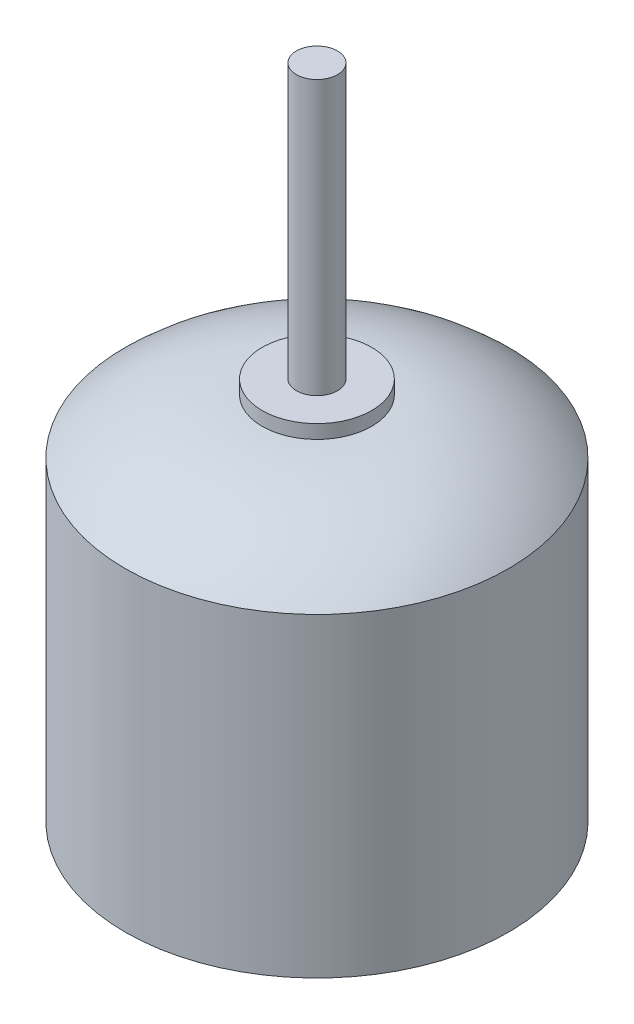
ISO-10303-21;
HEADER;
FILE_DESCRIPTION(('STEP AP214'),'2;1');
FILE_NAME('part.step','',(''),(''),'','','');
FILE_SCHEMA(('AUTOMOTIVE_DESIGN { 1 0 10303 214 1 1 1 1 }'));
ENDSEC;
DATA;
#1=APPLICATION_CONTEXT('core data for automotive mechanical design processes');
#2=APPLICATION_PROTOCOL_DEFINITION('international standard','automotive_design',2000,#1);
#3=PRODUCT_CONTEXT('',#1,'mechanical');
#4=PRODUCT('Part','Part','',(#3));
#5=PRODUCT_RELATED_PRODUCT_CATEGORY('part','',(#4));
#6=PRODUCT_DEFINITION_FORMATION('','',#4);
#7=PRODUCT_DEFINITION_CONTEXT('part definition',#1,'design');
#8=PRODUCT_DEFINITION('design','',#6,#7);
#9=PRODUCT_DEFINITION_SHAPE('','',#8);
#10=(LENGTH_UNIT() NAMED_UNIT(*) SI_UNIT(.MILLI.,.METRE.));
#11=(NAMED_UNIT(*) PLANE_ANGLE_UNIT() SI_UNIT($,.RADIAN.));
#12=(NAMED_UNIT(*) SI_UNIT($,.STERADIAN.) SOLID_ANGLE_UNIT());
#13=UNCERTAINTY_MEASURE_WITH_UNIT(LENGTH_MEASURE(1.E-05),#10,'distance_accuracy_value','');
#14=(GEOMETRIC_REPRESENTATION_CONTEXT(3) GLOBAL_UNCERTAINTY_ASSIGNED_CONTEXT((#13)) GLOBAL_UNIT_ASSIGNED_CONTEXT((#10,
#11,#12)) REPRESENTATION_CONTEXT('',''));
#15=CARTESIAN_POINT('',(0.,0.,0.));
#16=DIRECTION('',(0.,0.,1.));
#17=DIRECTION('',(1.,0.,0.));
#18=AXIS2_PLACEMENT_3D('',#15,#16,#17);
#19=CARTESIAN_POINT('',(0.,28.,0.));
#20=DIRECTION('',(0.,-1.,0.));
#21=DIRECTION('',(0.,0.,-1.));
#22=AXIS2_PLACEMENT_3D('',#19,#20,#21);
#23=CYLINDRICAL_SURFACE('',#22,14.);
#24=CARTESIAN_POINT('',(0.,23.,0.));
#25=DIRECTION('',(0.,1.,0.));
#26=DIRECTION('',(0.,0.,1.));
#27=AXIS2_PLACEMENT_3D('',#24,#25,#26);
#28=CIRCLE('',#27,14.);
#29=CARTESIAN_POINT('',(0.,23.,14.));
#30=VERTEX_POINT('',#29);
#31=EDGE_CURVE('E52',#30,#30,#28,.T.);
#32=ORIENTED_EDGE('',*,*,#31,.F.);
#33=EDGE_LOOP('',(#32));
#34=FACE_BOUND('',#33,.T.);
#35=CARTESIAN_POINT('',(0.,0.,0.));
#36=DIRECTION('',(0.,1.,0.));
#37=DIRECTION('',(0.,0.,1.));
#38=AXIS2_PLACEMENT_3D('',#35,#36,#37);
#39=CIRCLE('',#38,14.);
#40=CARTESIAN_POINT('',(0.,0.,14.));
#41=VERTEX_POINT('',#40);
#42=EDGE_CURVE('E40',#41,#41,#39,.T.);
#43=ORIENTED_EDGE('',*,*,#42,.T.);
#44=EDGE_LOOP('',(#43));
#45=FACE_BOUND('',#44,.T.);
#46=ADVANCED_FACE('F37',(#34,#45),#23,.T.);
#47=CARTESIAN_POINT('',(0.,0.,0.));
#48=DIRECTION('',(0.,1.,0.));
#49=DIRECTION('',(0.,0.,1.));
#50=AXIS2_PLACEMENT_3D('',#47,#48,#49);
#51=PLANE('',#50);
#52=CARTESIAN_POINT('',(0.,0.,8.));
#53=DIRECTION('',(0.,-1.,0.));
#54=DIRECTION('',(0.,0.,-1.));
#55=AXIS2_PLACEMENT_3D('',#52,#53,#54);
#56=CIRCLE('',#55,1.5);
#57=CARTESIAN_POINT('',(0.,0.,6.5));
#58=VERTEX_POINT('',#57);
#59=EDGE_CURVE('E64',#58,#58,#56,.T.);
#60=ORIENTED_EDGE('',*,*,#59,.F.);
#61=EDGE_LOOP('',(#60));
#62=FACE_BOUND('',#61,.T.);
#63=CARTESIAN_POINT('',(9.5,0.,0.));
#64=DIRECTION('',(0.,-1.,0.));
#65=DIRECTION('',(0.,0.,-1.));
#66=AXIS2_PLACEMENT_3D('',#63,#64,#65);
#67=CIRCLE('',#66,1.5);
#68=CARTESIAN_POINT('',(9.5,0.,-1.5));
#69=VERTEX_POINT('',#68);
#70=EDGE_CURVE('E67',#69,#69,#67,.T.);
#71=ORIENTED_EDGE('',*,*,#70,.F.);
#72=EDGE_LOOP('',(#71));
#73=FACE_BOUND('',#72,.T.);
#74=CARTESIAN_POINT('',(0.,0.,-8.));
#75=DIRECTION('',(0.,-1.,0.));
#76=DIRECTION('',(0.,0.,-1.));
#77=AXIS2_PLACEMENT_3D('',#74,#75,#76);
#78=CIRCLE('',#77,1.5);
#79=CARTESIAN_POINT('',(0.,0.,-9.5));
#80=VERTEX_POINT('',#79);
#81=EDGE_CURVE('E73',#80,#80,#78,.T.);
#82=ORIENTED_EDGE('',*,*,#81,.F.);
#83=EDGE_LOOP('',(#82));
#84=FACE_BOUND('',#83,.T.);
#85=CARTESIAN_POINT('',(-9.5,0.,0.));
#86=DIRECTION('',(0.,-1.,0.));
#87=DIRECTION('',(0.,0.,-1.));
#88=AXIS2_PLACEMENT_3D('',#85,#86,#87);
#89=CIRCLE('',#88,1.5);
#90=CARTESIAN_POINT('',(-9.5,0.,-1.5));
#91=VERTEX_POINT('',#90);
#92=EDGE_CURVE('E79',#91,#91,#89,.T.);
#93=ORIENTED_EDGE('',*,*,#92,.F.);
#94=EDGE_LOOP('',(#93));
#95=FACE_BOUND('',#94,.T.);
#96=ORIENTED_EDGE('',*,*,#42,.F.);
#97=EDGE_LOOP('',(#96));
#98=FACE_BOUND('',#97,.T.);
#99=ADVANCED_FACE('F89',(#62,#73,#84,#95,#98),#51,.F.);
#100=CARTESIAN_POINT('',(-9.5,4.,0.));
#101=DIRECTION('',(0.,-1.,0.));
#102=DIRECTION('',(0.,0.,-1.));
#103=AXIS2_PLACEMENT_3D('',#100,#101,#102);
#104=CYLINDRICAL_SURFACE('',#103,1.5);
#105=CARTESIAN_POINT('',(-9.5,4.,0.));
#106=DIRECTION('',(0.,-1.,0.));
#107=DIRECTION('',(0.,0.,-1.));
#108=AXIS2_PLACEMENT_3D('',#105,#106,#107);
#109=CIRCLE('',#108,1.5);
#110=CARTESIAN_POINT('',(-9.5,4.,-1.5));
#111=VERTEX_POINT('',#110);
#112=EDGE_CURVE('E61',#111,#111,#109,.T.);
#113=ORIENTED_EDGE('',*,*,#112,.F.);
#114=EDGE_LOOP('',(#113));
#115=FACE_BOUND('',#114,.T.);
#116=ORIENTED_EDGE('',*,*,#92,.T.);
#117=EDGE_LOOP('',(#116));
#118=FACE_BOUND('',#117,.T.);
#119=ADVANCED_FACE('F86',(#115,#118),#104,.F.);
#120=CARTESIAN_POINT('',(-9.5,4.,0.));
#121=DIRECTION('',(0.,-1.,0.));
#122=DIRECTION('',(0.,0.,-1.));
#123=AXIS2_PLACEMENT_3D('',#120,#121,#122);
#124=PLANE('',#123);
#125=ORIENTED_EDGE('',*,*,#112,.T.);
#126=EDGE_LOOP('',(#125));
#127=FACE_BOUND('',#126,.T.);
#128=ADVANCED_FACE('F84',(#127),#124,.T.);
#129=CARTESIAN_POINT('',(0.,4.,-8.));
#130=DIRECTION('',(0.,-1.,0.));
#131=DIRECTION('',(0.,0.,-1.));
#132=AXIS2_PLACEMENT_3D('',#129,#130,#131);
#133=CYLINDRICAL_SURFACE('',#132,1.5);
#134=CARTESIAN_POINT('',(0.,4.,-8.));
#135=DIRECTION('',(0.,-1.,0.));
#136=DIRECTION('',(0.,0.,-1.));
#137=AXIS2_PLACEMENT_3D('',#134,#135,#136);
#138=CIRCLE('',#137,1.5);
#139=CARTESIAN_POINT('',(0.,4.,-9.5));
#140=VERTEX_POINT('',#139);
#141=EDGE_CURVE('E76',#140,#140,#138,.T.);
#142=ORIENTED_EDGE('',*,*,#141,.F.);
#143=EDGE_LOOP('',(#142));
#144=FACE_BOUND('',#143,.T.);
#145=ORIENTED_EDGE('',*,*,#81,.T.);
#146=EDGE_LOOP('',(#145));
#147=FACE_BOUND('',#146,.T.);
#148=ADVANCED_FACE('F135',(#144,#147),#133,.F.);
#149=CARTESIAN_POINT('',(0.,4.,-8.));
#150=DIRECTION('',(0.,-1.,0.));
#151=DIRECTION('',(0.,0.,-1.));
#152=AXIS2_PLACEMENT_3D('',#149,#150,#151);
#153=PLANE('',#152);
#154=ORIENTED_EDGE('',*,*,#141,.T.);
#155=EDGE_LOOP('',(#154));
#156=FACE_BOUND('',#155,.T.);
#157=ADVANCED_FACE('F130',(#156),#153,.T.);
#158=CARTESIAN_POINT('',(9.5,4.,0.));
#159=DIRECTION('',(0.,-1.,0.));
#160=DIRECTION('',(0.,0.,-1.));
#161=AXIS2_PLACEMENT_3D('',#158,#159,#160);
#162=CYLINDRICAL_SURFACE('',#161,1.5);
#163=CARTESIAN_POINT('',(9.5,4.,0.));
#164=DIRECTION('',(0.,-1.,0.));
#165=DIRECTION('',(0.,0.,-1.));
#166=AXIS2_PLACEMENT_3D('',#163,#164,#165);
#167=CIRCLE('',#166,1.5);
#168=CARTESIAN_POINT('',(9.5,4.,-1.5));
#169=VERTEX_POINT('',#168);
#170=EDGE_CURVE('E70',#169,#169,#167,.T.);
#171=ORIENTED_EDGE('',*,*,#170,.F.);
#172=EDGE_LOOP('',(#171));
#173=FACE_BOUND('',#172,.T.);
#174=ORIENTED_EDGE('',*,*,#70,.T.);
#175=EDGE_LOOP('',(#174));
#176=FACE_BOUND('',#175,.T.);
#177=ADVANCED_FACE('F127',(#173,#176),#162,.F.);
#178=CARTESIAN_POINT('',(9.5,4.,0.));
#179=DIRECTION('',(0.,-1.,0.));
#180=DIRECTION('',(0.,0.,-1.));
#181=AXIS2_PLACEMENT_3D('',#178,#179,#180);
#182=PLANE('',#181);
#183=ORIENTED_EDGE('',*,*,#170,.T.);
#184=EDGE_LOOP('',(#183));
#185=FACE_BOUND('',#184,.T.);
#186=ADVANCED_FACE('F125',(#185),#182,.T.);
#187=CARTESIAN_POINT('',(0.,4.,8.));
#188=DIRECTION('',(0.,-1.,0.));
#189=DIRECTION('',(0.,0.,-1.));
#190=AXIS2_PLACEMENT_3D('',#187,#188,#189);
#191=CYLINDRICAL_SURFACE('',#190,1.5);
#192=CARTESIAN_POINT('',(0.,4.,8.));
#193=DIRECTION('',(0.,-1.,0.));
#194=DIRECTION('',(0.,0.,-1.));
#195=AXIS2_PLACEMENT_3D('',#192,#193,#194);
#196=CIRCLE('',#195,1.5);
#197=CARTESIAN_POINT('',(0.,4.,6.5));
#198=VERTEX_POINT('',#197);
#199=EDGE_CURVE('E48',#198,#198,#196,.T.);
#200=ORIENTED_EDGE('',*,*,#199,.F.);
#201=EDGE_LOOP('',(#200));
#202=FACE_BOUND('',#201,.T.);
#203=ORIENTED_EDGE('',*,*,#59,.T.);
#204=EDGE_LOOP('',(#203));
#205=FACE_BOUND('',#204,.T.);
#206=ADVANCED_FACE('F117',(#202,#205),#191,.F.);
#207=CARTESIAN_POINT('',(0.,4.,8.));
#208=DIRECTION('',(0.,-1.,0.));
#209=DIRECTION('',(0.,0.,-1.));
#210=AXIS2_PLACEMENT_3D('',#207,#208,#209);
#211=PLANE('',#210);
#212=ORIENTED_EDGE('',*,*,#199,.T.);
#213=EDGE_LOOP('',(#212));
#214=FACE_BOUND('',#213,.T.);
#215=ADVANCED_FACE('F108',(#214),#211,.T.);
#216=CARTESIAN_POINT('',(0.,12.5,0.));
#217=DIRECTION('',(0.,1.,0.));
#218=DIRECTION('',(0.,0.,1.));
#219=AXIS2_PLACEMENT_3D('',#216,#217,#218);
#220=DEGENERATE_TOROIDAL_SURFACE('',#219,4.,14.5,.T.);
#221=CARTESIAN_POINT('',(0.,27.,0.));
#222=DIRECTION('',(0.,1.,0.));
#223=DIRECTION('',(0.,0.,1.));
#224=AXIS2_PLACEMENT_3D('',#221,#222,#223);
#225=CIRCLE('',#224,4.);
#226=CARTESIAN_POINT('',(0.,27.,4.));
#227=VERTEX_POINT('',#226);
#228=EDGE_CURVE('E58',#227,#227,#225,.T.);
#229=ORIENTED_EDGE('',*,*,#228,.F.);
#230=EDGE_LOOP('',(#229));
#231=FACE_BOUND('',#230,.T.);
#232=ORIENTED_EDGE('',*,*,#31,.T.);
#233=EDGE_LOOP('',(#232));
#234=FACE_BOUND('',#233,.T.);
#235=ADVANCED_FACE('F106',(#231,#234),#220,.T.);
#236=CARTESIAN_POINT('',(0.,28.,0.));
#237=DIRECTION('',(0.,1.,0.));
#238=DIRECTION('',(0.,0.,1.));
#239=AXIS2_PLACEMENT_3D('',#236,#237,#238);
#240=CYLINDRICAL_SURFACE('',#239,4.);
#241=CARTESIAN_POINT('',(0.,28.,0.));
#242=DIRECTION('',(0.,1.,0.));
#243=DIRECTION('',(0.,0.,1.));
#244=AXIS2_PLACEMENT_3D('',#241,#242,#243);
#245=CIRCLE('',#244,4.);
#246=CARTESIAN_POINT('',(0.,28.,4.));
#247=VERTEX_POINT('',#246);
#248=EDGE_CURVE('E55',#247,#247,#245,.T.);
#249=ORIENTED_EDGE('',*,*,#248,.F.);
#250=EDGE_LOOP('',(#249));
#251=FACE_BOUND('',#250,.T.);
#252=ORIENTED_EDGE('',*,*,#228,.T.);
#253=EDGE_LOOP('',(#252));
#254=FACE_BOUND('',#253,.T.);
#255=ADVANCED_FACE('F107',(#251,#254),#240,.T.);
#256=CARTESIAN_POINT('',(0.,28.,0.));
#257=DIRECTION('',(0.,1.,0.));
#258=DIRECTION('',(0.,0.,1.));
#259=AXIS2_PLACEMENT_3D('',#256,#257,#258);
#260=PLANE('',#259);
#261=CARTESIAN_POINT('',(0.,28.,0.));
#262=DIRECTION('',(0.,1.,0.));
#263=DIRECTION('',(0.,0.,1.));
#264=AXIS2_PLACEMENT_3D('',#261,#262,#263);
#265=CIRCLE('',#264,1.5);
#266=CARTESIAN_POINT('',(0.,28.,1.5));
#267=VERTEX_POINT('',#266);
#268=EDGE_CURVE('E10',#267,#267,#265,.T.);
#269=ORIENTED_EDGE('',*,*,#268,.F.);
#270=EDGE_LOOP('',(#269));
#271=FACE_BOUND('',#270,.T.);
#272=ORIENTED_EDGE('',*,*,#248,.T.);
#273=EDGE_LOOP('',(#272));
#274=FACE_BOUND('',#273,.T.);
#275=ADVANCED_FACE('F114',(#271,#274),#260,.T.);
#276=CARTESIAN_POINT('',(0.,48.,0.));
#277=DIRECTION('',(0.,-1.,0.));
#278=DIRECTION('',(0.,0.,-1.));
#279=AXIS2_PLACEMENT_3D('',#276,#277,#278);
#280=CYLINDRICAL_SURFACE('',#279,1.5);
#281=CARTESIAN_POINT('',(0.,48.,0.));
#282=DIRECTION('',(0.,1.,0.));
#283=DIRECTION('',(0.,0.,1.));
#284=AXIS2_PLACEMENT_3D('',#281,#282,#283);
#285=CIRCLE('',#284,1.5);
#286=CARTESIAN_POINT('',(0.,48.,1.5));
#287=VERTEX_POINT('',#286);
#288=EDGE_CURVE('E51',#287,#287,#285,.T.);
#289=ORIENTED_EDGE('',*,*,#288,.F.);
#290=EDGE_LOOP('',(#289));
#291=FACE_BOUND('',#290,.T.);
#292=ORIENTED_EDGE('',*,*,#268,.T.);
#293=EDGE_LOOP('',(#292));
#294=FACE_BOUND('',#293,.T.);
#295=ADVANCED_FACE('F145',(#291,#294),#280,.T.);
#296=CARTESIAN_POINT('',(0.,48.,0.));
#297=DIRECTION('',(0.,1.,0.));
#298=DIRECTION('',(0.,0.,1.));
#299=AXIS2_PLACEMENT_3D('',#296,#297,#298);
#300=PLANE('',#299);
#301=ORIENTED_EDGE('',*,*,#288,.T.);
#302=EDGE_LOOP('',(#301));
#303=FACE_BOUND('',#302,.T.);
#304=ADVANCED_FACE('F150',(#303),#300,.T.);
#305=CLOSED_SHELL('',(#46,#99,#119,#128,#148,#157,#177,#186,#206,#215,#235,#255,#275,#295,#304));
#306=MANIFOLD_SOLID_BREP('B2',#305);
#307=ADVANCED_BREP_SHAPE_REPRESENTATION('',(#18,#306),#14);
#308=SHAPE_DEFINITION_REPRESENTATION(#9,#307);
ENDSEC;
END-ISO-10303-21;
